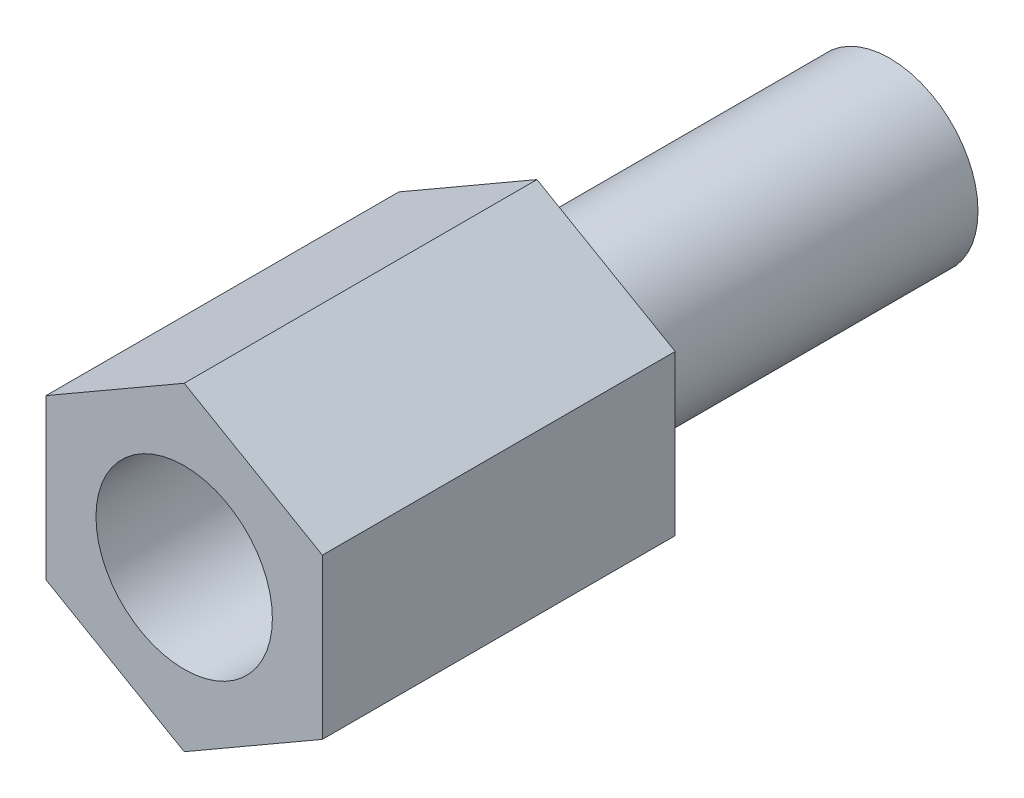
ISO-10303-21;
HEADER;
FILE_DESCRIPTION(('STEP AP214'),'2;1');
FILE_NAME('part.step','',(''),(''),'','','');
FILE_SCHEMA(('AUTOMOTIVE_DESIGN { 1 0 10303 214 1 1 1 1 }'));
ENDSEC;
DATA;
#1=APPLICATION_CONTEXT('core data for automotive mechanical design processes');
#2=APPLICATION_PROTOCOL_DEFINITION('international standard','automotive_design',2000,#1);
#3=PRODUCT_CONTEXT('',#1,'mechanical');
#4=PRODUCT('Part','Part','',(#3));
#5=PRODUCT_RELATED_PRODUCT_CATEGORY('part','',(#4));
#6=PRODUCT_DEFINITION_FORMATION('','',#4);
#7=PRODUCT_DEFINITION_CONTEXT('part definition',#1,'design');
#8=PRODUCT_DEFINITION('design','',#6,#7);
#9=PRODUCT_DEFINITION_SHAPE('','',#8);
#10=(LENGTH_UNIT() NAMED_UNIT(*) SI_UNIT(.MILLI.,.METRE.));
#11=(NAMED_UNIT(*) PLANE_ANGLE_UNIT() SI_UNIT($,.RADIAN.));
#12=(NAMED_UNIT(*) SI_UNIT($,.STERADIAN.) SOLID_ANGLE_UNIT());
#13=UNCERTAINTY_MEASURE_WITH_UNIT(LENGTH_MEASURE(1.E-05),#10,'distance_accuracy_value','');
#14=(GEOMETRIC_REPRESENTATION_CONTEXT(3) GLOBAL_UNCERTAINTY_ASSIGNED_CONTEXT((#13)) GLOBAL_UNIT_ASSIGNED_CONTEXT((#10,
#11,#12)) REPRESENTATION_CONTEXT('',''));
#15=CARTESIAN_POINT('',(0.,0.,0.));
#16=DIRECTION('',(0.,0.,1.));
#17=DIRECTION('',(1.,0.,0.));
#18=AXIS2_PLACEMENT_3D('',#15,#16,#17);
#19=CARTESIAN_POINT('',(0.,0.,-6.));
#20=DIRECTION('',(0.,0.,1.));
#21=DIRECTION('',(1.,0.,0.));
#22=AXIS2_PLACEMENT_3D('',#19,#20,#21);
#23=CYLINDRICAL_SURFACE('',#22,1.5);
#24=CARTESIAN_POINT('',(0.,0.,-6.));
#25=DIRECTION('',(0.,0.,1.));
#26=DIRECTION('',(1.,0.,0.));
#27=AXIS2_PLACEMENT_3D('',#24,#25,#26);
#28=CIRCLE('',#27,1.5);
#29=CARTESIAN_POINT('',(1.5,0.,-6.));
#30=VERTEX_POINT('',#29);
#31=EDGE_CURVE('E11',#30,#30,#28,.T.);
#32=ORIENTED_EDGE('',*,*,#31,.T.);
#33=EDGE_LOOP('',(#32));
#34=FACE_BOUND('',#33,.T.);
#35=CARTESIAN_POINT('',(0.,0.,0.));
#36=DIRECTION('',(0.,0.,1.));
#37=DIRECTION('',(1.,0.,0.));
#38=AXIS2_PLACEMENT_3D('',#35,#36,#37);
#39=CIRCLE('',#38,1.5);
#40=CARTESIAN_POINT('',(1.5,0.,0.));
#41=VERTEX_POINT('',#40);
#42=EDGE_CURVE('E56',#41,#41,#39,.T.);
#43=ORIENTED_EDGE('',*,*,#42,.F.);
#44=EDGE_LOOP('',(#43));
#45=FACE_BOUND('',#44,.T.);
#46=ADVANCED_FACE('F53',(#34,#45),#23,.T.);
#47=CARTESIAN_POINT('',(0.,0.,-6.));
#48=DIRECTION('',(0.,0.,1.));
#49=DIRECTION('',(1.,0.,0.));
#50=AXIS2_PLACEMENT_3D('',#47,#48,#49);
#51=PLANE('',#50);
#52=ORIENTED_EDGE('',*,*,#31,.F.);
#53=EDGE_LOOP('',(#52));
#54=FACE_BOUND('',#53,.T.);
#55=ADVANCED_FACE('F68',(#54),#51,.F.);
#56=CARTESIAN_POINT('',(0.,0.,0.));
#57=DIRECTION('',(0.,0.,1.));
#58=DIRECTION('',(1.,0.,0.));
#59=AXIS2_PLACEMENT_3D('',#56,#57,#58);
#60=PLANE('',#59);
#61=ORIENTED_EDGE('',*,*,#42,.T.);
#62=EDGE_LOOP('',(#61));
#63=FACE_BOUND('',#62,.T.);
#64=ADVANCED_FACE('F65',(#63),#60,.T.);
#65=CLOSED_SHELL('',(#46,#55,#64));
#66=MANIFOLD_SOLID_BREP('B2',#65);
#67=CARTESIAN_POINT('',(0.,0.,6.));
#68=DIRECTION('',(0.,0.,1.));
#69=DIRECTION('',(1.,0.,0.));
#70=AXIS2_PLACEMENT_3D('',#67,#68,#69);
#71=PLANE('',#70);
#72=DIRECTION('',(-0.866025403784439,0.5,0.));
#73=VECTOR('',#72,1.);
#74=CARTESIAN_POINT('',(2.35,1.35677313259562,6.));
#75=LINE('',#74,#73);
#76=CARTESIAN_POINT('',(2.35,1.35677313259562,6.));
#77=VERTEX_POINT('',#76);
#78=CARTESIAN_POINT('',(0.,2.71354626519124,6.));
#79=VERTEX_POINT('',#78);
#80=EDGE_CURVE('E201',#77,#79,#75,.T.);
#81=ORIENTED_EDGE('',*,*,#80,.T.);
#82=DIRECTION('',(-0.866025403784438,-0.5,0.));
#83=VECTOR('',#82,1.);
#84=CARTESIAN_POINT('',(0.,2.71354626519124,6.));
#85=LINE('',#84,#83);
#86=CARTESIAN_POINT('',(-2.35,1.35677313259562,6.));
#87=VERTEX_POINT('',#86);
#88=EDGE_CURVE('E149',#79,#87,#85,.T.);
#89=ORIENTED_EDGE('',*,*,#88,.T.);
#90=DIRECTION('',(0.,-1.,0.));
#91=VECTOR('',#90,1.);
#92=CARTESIAN_POINT('',(-2.35,1.35677313259562,6.));
#93=LINE('',#92,#91);
#94=CARTESIAN_POINT('',(-2.35,-1.35677313259562,6.));
#95=VERTEX_POINT('',#94);
#96=EDGE_CURVE('E162',#87,#95,#93,.T.);
#97=ORIENTED_EDGE('',*,*,#96,.T.);
#98=DIRECTION('',(0.866025403784439,-0.5,0.));
#99=VECTOR('',#98,1.);
#100=CARTESIAN_POINT('',(-2.35,-1.35677313259562,6.));
#101=LINE('',#100,#99);
#102=CARTESIAN_POINT('',(0.,-2.71354626519124,6.));
#103=VERTEX_POINT('',#102);
#104=EDGE_CURVE('E156',#95,#103,#101,.T.);
#105=ORIENTED_EDGE('',*,*,#104,.T.);
#106=DIRECTION('',(0.866025403784439,0.5,0.));
#107=VECTOR('',#106,1.);
#108=CARTESIAN_POINT('',(0.,-2.71354626519124,6.));
#109=LINE('',#108,#107);
#110=CARTESIAN_POINT('',(2.35,-1.35677313259562,6.));
#111=VERTEX_POINT('',#110);
#112=EDGE_CURVE('E160',#103,#111,#109,.T.);
#113=ORIENTED_EDGE('',*,*,#112,.T.);
#114=DIRECTION('',(0.,1.,0.));
#115=VECTOR('',#114,1.);
#116=CARTESIAN_POINT('',(2.35,-1.35677313259562,6.));
#117=LINE('',#116,#115);
#118=EDGE_CURVE('E112',#111,#77,#117,.T.);
#119=ORIENTED_EDGE('',*,*,#118,.T.);
#120=EDGE_LOOP('',(#81,#89,#97,#105,#113,#119));
#121=FACE_BOUND('',#120,.T.);
#122=CARTESIAN_POINT('',(0.,0.,6.));
#123=DIRECTION('',(0.,0.,1.));
#124=DIRECTION('',(1.,0.,0.));
#125=AXIS2_PLACEMENT_3D('',#122,#123,#124);
#126=CIRCLE('',#125,1.5);
#127=CARTESIAN_POINT('',(1.5,0.,6.));
#128=VERTEX_POINT('',#127);
#129=EDGE_CURVE('E189',#128,#128,#126,.T.);
#130=ORIENTED_EDGE('',*,*,#129,.F.);
#131=EDGE_LOOP('',(#130));
#132=FACE_BOUND('',#131,.T.);
#133=ADVANCED_FACE('F94',(#121,#132),#71,.T.);
#134=CARTESIAN_POINT('',(0.,0.,0.));
#135=DIRECTION('',(0.,0.,1.));
#136=DIRECTION('',(1.,0.,0.));
#137=AXIS2_PLACEMENT_3D('',#134,#135,#136);
#138=PLANE('',#137);
#139=DIRECTION('',(-0.866025403784439,0.5,0.));
#140=VECTOR('',#139,1.);
#141=CARTESIAN_POINT('',(2.35,1.35677313259562,0.));
#142=LINE('',#141,#140);
#143=CARTESIAN_POINT('',(2.35,1.35677313259562,0.));
#144=VERTEX_POINT('',#143);
#145=CARTESIAN_POINT('',(0.,2.71354626519124,0.));
#146=VERTEX_POINT('',#145);
#147=EDGE_CURVE('E184',#144,#146,#142,.T.);
#148=ORIENTED_EDGE('',*,*,#147,.F.);
#149=DIRECTION('',(0.,1.,0.));
#150=VECTOR('',#149,1.);
#151=CARTESIAN_POINT('',(2.35,-1.35677313259562,0.));
#152=LINE('',#151,#150);
#153=CARTESIAN_POINT('',(2.35,-1.35677313259562,0.));
#154=VERTEX_POINT('',#153);
#155=EDGE_CURVE('E141',#154,#144,#152,.T.);
#156=ORIENTED_EDGE('',*,*,#155,.F.);
#157=DIRECTION('',(0.866025403784439,0.5,0.));
#158=VECTOR('',#157,1.);
#159=CARTESIAN_POINT('',(0.,-2.71354626519124,0.));
#160=LINE('',#159,#158);
#161=CARTESIAN_POINT('',(0.,-2.71354626519124,0.));
#162=VERTEX_POINT('',#161);
#163=EDGE_CURVE('E135',#162,#154,#160,.T.);
#164=ORIENTED_EDGE('',*,*,#163,.F.);
#165=DIRECTION('',(0.866025403784439,-0.5,0.));
#166=VECTOR('',#165,1.);
#167=CARTESIAN_POINT('',(-2.35,-1.35677313259562,0.));
#168=LINE('',#167,#166);
#169=CARTESIAN_POINT('',(-2.35,-1.35677313259562,0.));
#170=VERTEX_POINT('',#169);
#171=EDGE_CURVE('E171',#170,#162,#168,.T.);
#172=ORIENTED_EDGE('',*,*,#171,.F.);
#173=DIRECTION('',(0.,-1.,0.));
#174=VECTOR('',#173,1.);
#175=CARTESIAN_POINT('',(-2.35,1.35677313259562,0.));
#176=LINE('',#175,#174);
#177=CARTESIAN_POINT('',(-2.35,1.35677313259562,0.));
#178=VERTEX_POINT('',#177);
#179=EDGE_CURVE('E192',#178,#170,#176,.T.);
#180=ORIENTED_EDGE('',*,*,#179,.F.);
#181=DIRECTION('',(-0.866025403784438,-0.5,0.));
#182=VECTOR('',#181,1.);
#183=CARTESIAN_POINT('',(0.,2.71354626519124,0.));
#184=LINE('',#183,#182);
#185=EDGE_CURVE('E188',#146,#178,#184,.T.);
#186=ORIENTED_EDGE('',*,*,#185,.F.);
#187=EDGE_LOOP('',(#148,#156,#164,#172,#180,#186));
#188=FACE_BOUND('',#187,.T.);
#189=CARTESIAN_POINT('',(0.,0.,0.));
#190=DIRECTION('',(0.,0.,1.));
#191=DIRECTION('',(1.,0.,0.));
#192=AXIS2_PLACEMENT_3D('',#189,#190,#191);
#193=CIRCLE('',#192,1.5);
#194=CARTESIAN_POINT('',(1.5,0.,0.));
#195=VERTEX_POINT('',#194);
#196=EDGE_CURVE('E298',#195,#195,#193,.T.);
#197=ORIENTED_EDGE('',*,*,#196,.T.);
#198=EDGE_LOOP('',(#197));
#199=FACE_BOUND('',#198,.T.);
#200=ADVANCED_FACE('F214',(#188,#199),#138,.F.);
#201=CARTESIAN_POINT('',(2.35,1.35677313259562,6.));
#202=DIRECTION('',(-0.5,-0.866025403784439,0.));
#203=DIRECTION('',(0.866025403784439,-0.5,0.));
#204=AXIS2_PLACEMENT_3D('',#201,#202,#203);
#205=PLANE('',#204);
#206=ORIENTED_EDGE('',*,*,#147,.T.);
#207=DIRECTION('',(0.,0.,-1.));
#208=VECTOR('',#207,1.);
#209=CARTESIAN_POINT('',(0.,2.71354626519124,6.));
#210=LINE('',#209,#208);
#211=EDGE_CURVE('E51',#79,#146,#210,.T.);
#212=ORIENTED_EDGE('',*,*,#211,.F.);
#213=ORIENTED_EDGE('',*,*,#80,.F.);
#214=DIRECTION('',(0.,0.,-1.));
#215=VECTOR('',#214,1.);
#216=CARTESIAN_POINT('',(2.35,1.35677313259562,6.));
#217=LINE('',#216,#215);
#218=EDGE_CURVE('E180',#77,#144,#217,.T.);
#219=ORIENTED_EDGE('',*,*,#218,.T.);
#220=EDGE_LOOP('',(#206,#212,#213,#219));
#221=FACE_BOUND('',#220,.T.);
#222=ADVANCED_FACE('F96',(#221),#205,.F.);
#223=CARTESIAN_POINT('',(0.,2.71354626519124,6.));
#224=DIRECTION('',(0.5,-0.866025403784439,0.));
#225=DIRECTION('',(0.866025403784439,0.5,0.));
#226=AXIS2_PLACEMENT_3D('',#223,#224,#225);
#227=PLANE('',#226);
#228=ORIENTED_EDGE('',*,*,#185,.T.);
#229=DIRECTION('',(0.,0.,-1.));
#230=VECTOR('',#229,1.);
#231=CARTESIAN_POINT('',(-2.35,1.35677313259562,6.));
#232=LINE('',#231,#230);
#233=EDGE_CURVE('E104',#87,#178,#232,.T.);
#234=ORIENTED_EDGE('',*,*,#233,.F.);
#235=ORIENTED_EDGE('',*,*,#88,.F.);
#236=ORIENTED_EDGE('',*,*,#211,.T.);
#237=EDGE_LOOP('',(#228,#234,#235,#236));
#238=FACE_BOUND('',#237,.T.);
#239=ADVANCED_FACE('F239',(#238),#227,.F.);
#240=CARTESIAN_POINT('',(-2.35,1.35677313259562,6.));
#241=DIRECTION('',(1.,0.,0.));
#242=DIRECTION('',(0.,1.,0.));
#243=AXIS2_PLACEMENT_3D('',#240,#241,#242);
#244=PLANE('',#243);
#245=ORIENTED_EDGE('',*,*,#179,.T.);
#246=DIRECTION('',(0.,0.,-1.));
#247=VECTOR('',#246,1.);
#248=CARTESIAN_POINT('',(-2.35,-1.35677313259562,6.));
#249=LINE('',#248,#247);
#250=EDGE_CURVE('E173',#95,#170,#249,.T.);
#251=ORIENTED_EDGE('',*,*,#250,.F.);
#252=ORIENTED_EDGE('',*,*,#96,.F.);
#253=ORIENTED_EDGE('',*,*,#233,.T.);
#254=EDGE_LOOP('',(#245,#251,#252,#253));
#255=FACE_BOUND('',#254,.T.);
#256=ADVANCED_FACE('F211',(#255),#244,.F.);
#257=CARTESIAN_POINT('',(-2.35,-1.35677313259562,6.));
#258=DIRECTION('',(0.5,0.866025403784439,0.));
#259=DIRECTION('',(-0.866025403784439,0.5,0.));
#260=AXIS2_PLACEMENT_3D('',#257,#258,#259);
#261=PLANE('',#260);
#262=ORIENTED_EDGE('',*,*,#171,.T.);
#263=DIRECTION('',(0.,0.,-1.));
#264=VECTOR('',#263,1.);
#265=CARTESIAN_POINT('',(0.,-2.71354626519124,6.));
#266=LINE('',#265,#264);
#267=EDGE_CURVE('E168',#103,#162,#266,.T.);
#268=ORIENTED_EDGE('',*,*,#267,.F.);
#269=ORIENTED_EDGE('',*,*,#104,.F.);
#270=ORIENTED_EDGE('',*,*,#250,.T.);
#271=EDGE_LOOP('',(#262,#268,#269,#270));
#272=FACE_BOUND('',#271,.T.);
#273=ADVANCED_FACE('F169',(#272),#261,.F.);
#274=CARTESIAN_POINT('',(0.,-2.71354626519124,6.));
#275=DIRECTION('',(-0.5,0.866025403784439,0.));
#276=DIRECTION('',(-0.866025403784439,-0.5,0.));
#277=AXIS2_PLACEMENT_3D('',#274,#275,#276);
#278=PLANE('',#277);
#279=ORIENTED_EDGE('',*,*,#163,.T.);
#280=DIRECTION('',(0.,0.,-1.));
#281=VECTOR('',#280,1.);
#282=CARTESIAN_POINT('',(2.35,-1.35677313259562,6.));
#283=LINE('',#282,#281);
#284=EDGE_CURVE('E174',#111,#154,#283,.T.);
#285=ORIENTED_EDGE('',*,*,#284,.F.);
#286=ORIENTED_EDGE('',*,*,#112,.F.);
#287=ORIENTED_EDGE('',*,*,#267,.T.);
#288=EDGE_LOOP('',(#279,#285,#286,#287));
#289=FACE_BOUND('',#288,.T.);
#290=ADVANCED_FACE('F176',(#289),#278,.F.);
#291=CARTESIAN_POINT('',(2.35,-1.35677313259562,6.));
#292=DIRECTION('',(-1.,0.,0.));
#293=DIRECTION('',(0.,0.,1.));
#294=AXIS2_PLACEMENT_3D('',#291,#292,#293);
#295=PLANE('',#294);
#296=ORIENTED_EDGE('',*,*,#155,.T.);
#297=ORIENTED_EDGE('',*,*,#218,.F.);
#298=ORIENTED_EDGE('',*,*,#118,.F.);
#299=ORIENTED_EDGE('',*,*,#284,.T.);
#300=EDGE_LOOP('',(#296,#297,#298,#299));
#301=FACE_BOUND('',#300,.T.);
#302=ADVANCED_FACE('F219',(#301),#295,.F.);
#303=CARTESIAN_POINT('',(0.,0.,6.));
#304=DIRECTION('',(0.,0.,-1.));
#305=DIRECTION('',(-1.,0.,0.));
#306=AXIS2_PLACEMENT_3D('',#303,#304,#305);
#307=CYLINDRICAL_SURFACE('',#306,1.5);
#308=ORIENTED_EDGE('',*,*,#129,.T.);
#309=EDGE_LOOP('',(#308));
#310=FACE_BOUND('',#309,.T.);
#311=ORIENTED_EDGE('',*,*,#196,.F.);
#312=EDGE_LOOP('',(#311));
#313=FACE_BOUND('',#312,.T.);
#314=ADVANCED_FACE('F221',(#310,#313),#307,.F.);
#315=CLOSED_SHELL('',(#133,#200,#222,#239,#256,#273,#290,#302,#314));
#316=MANIFOLD_SOLID_BREP('B6',#315);
#317=ADVANCED_BREP_SHAPE_REPRESENTATION('',(#18,#66,#316),#14);
#318=SHAPE_DEFINITION_REPRESENTATION(#9,#317);
ENDSEC;
END-ISO-10303-21;
